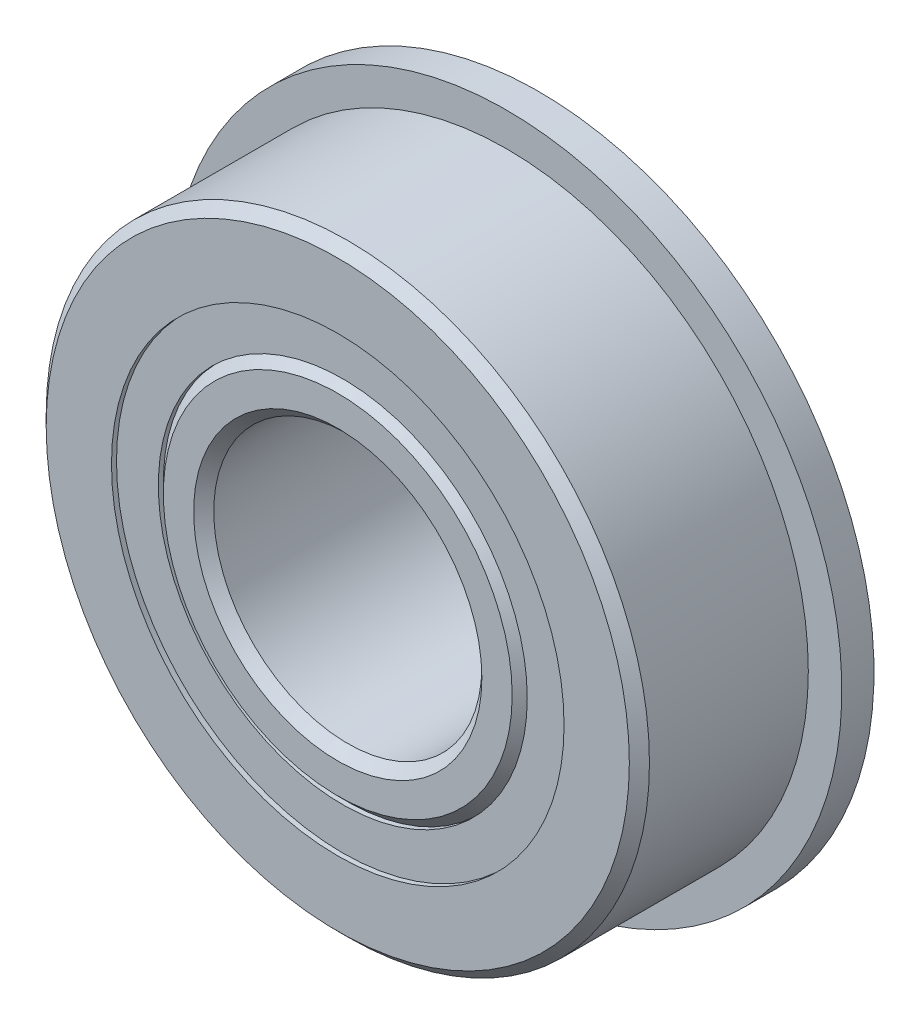
ISO-10303-21;
HEADER;
FILE_DESCRIPTION(('STEP AP214'),'2;1');
FILE_NAME('part.step','',(''),(''),'','','');
FILE_SCHEMA(('AUTOMOTIVE_DESIGN { 1 0 10303 214 1 1 1 1 }'));
ENDSEC;
DATA;
#1=APPLICATION_CONTEXT('core data for automotive mechanical design processes');
#2=APPLICATION_PROTOCOL_DEFINITION('international standard','automotive_design',2000,#1);
#3=PRODUCT_CONTEXT('',#1,'mechanical');
#4=PRODUCT('Part','Part','',(#3));
#5=PRODUCT_RELATED_PRODUCT_CATEGORY('part','',(#4));
#6=PRODUCT_DEFINITION_FORMATION('','',#4);
#7=PRODUCT_DEFINITION_CONTEXT('part definition',#1,'design');
#8=PRODUCT_DEFINITION('design','',#6,#7);
#9=PRODUCT_DEFINITION_SHAPE('','',#8);
#10=(LENGTH_UNIT() NAMED_UNIT(*) SI_UNIT(.MILLI.,.METRE.));
#11=(NAMED_UNIT(*) PLANE_ANGLE_UNIT() SI_UNIT($,.RADIAN.));
#12=(NAMED_UNIT(*) SI_UNIT($,.STERADIAN.) SOLID_ANGLE_UNIT());
#13=UNCERTAINTY_MEASURE_WITH_UNIT(LENGTH_MEASURE(1.E-05),#10,'distance_accuracy_value','');
#14=(GEOMETRIC_REPRESENTATION_CONTEXT(3) GLOBAL_UNCERTAINTY_ASSIGNED_CONTEXT((#13)) GLOBAL_UNIT_ASSIGNED_CONTEXT((#10,
#11,#12)) REPRESENTATION_CONTEXT('',''));
#15=CARTESIAN_POINT('',(0.,0.,0.));
#16=DIRECTION('',(0.,0.,1.));
#17=DIRECTION('',(1.,0.,0.));
#18=AXIS2_PLACEMENT_3D('',#15,#16,#17);
#19=CARTESIAN_POINT('',(0.,10.7188,-4.524375));
#20=DIRECTION('',(0.,0.,1.));
#21=DIRECTION('',(1.,0.,0.));
#22=AXIS2_PLACEMENT_3D('',#19,#20,#21);
#23=PLANE('',#22);
#24=CARTESIAN_POINT('',(0.,0.,-4.524375));
#25=DIRECTION('',(0.,0.,1.));
#26=DIRECTION('',(1.,0.,0.));
#27=AXIS2_PLACEMENT_3D('',#24,#25,#26);
#28=CIRCLE('',#27,10.7188);
#29=CARTESIAN_POINT('',(10.7188,0.,-4.524375));
#30=VERTEX_POINT('',#29);
#31=EDGE_CURVE('E58',#30,#30,#28,.T.);
#32=ORIENTED_EDGE('',*,*,#31,.F.);
#33=EDGE_LOOP('',(#32));
#34=FACE_BOUND('',#33,.T.);
#35=CARTESIAN_POINT('',(0.,0.,-4.524375));
#36=DIRECTION('',(0.,0.,1.));
#37=DIRECTION('',(1.,0.,0.));
#38=AXIS2_PLACEMENT_3D('',#35,#36,#37);
#39=CIRCLE('',#38,8.7376);
#40=CARTESIAN_POINT('',(8.7376,0.,-4.524375));
#41=VERTEX_POINT('',#40);
#42=EDGE_CURVE('E11',#41,#41,#39,.T.);
#43=ORIENTED_EDGE('',*,*,#42,.T.);
#44=EDGE_LOOP('',(#43));
#45=FACE_BOUND('',#44,.T.);
#46=ADVANCED_FACE('F44',(#34,#45),#23,.F.);
#47=CARTESIAN_POINT('',(0.,0.,4.7625));
#48=DIRECTION('',(0.,0.,1.));
#49=DIRECTION('',(1.,0.,0.));
#50=AXIS2_PLACEMENT_3D('',#47,#48,#49);
#51=CYLINDRICAL_SURFACE('',#50,8.7376);
#52=ORIENTED_EDGE('',*,*,#42,.F.);
#53=EDGE_LOOP('',(#52));
#54=FACE_BOUND('',#53,.T.);
#55=CARTESIAN_POINT('',(0.,0.,-1.78053818830151));
#56=DIRECTION('',(0.,0.,1.));
#57=DIRECTION('',(1.,0.,0.));
#58=AXIS2_PLACEMENT_3D('',#55,#56,#57);
#59=CIRCLE('',#58,8.7376);
#60=CARTESIAN_POINT('',(8.7376,0.,-1.78053818830151));
#61=VERTEX_POINT('',#60);
#62=EDGE_CURVE('E50',#61,#61,#59,.T.);
#63=ORIENTED_EDGE('',*,*,#62,.T.);
#64=EDGE_LOOP('',(#63));
#65=FACE_BOUND('',#64,.T.);
#66=ADVANCED_FACE('F67',(#54,#65),#51,.F.);
#67=CARTESIAN_POINT('',(0.,10.7188,-1.78053818830151));
#68=DIRECTION('',(0.,0.,-1.));
#69=DIRECTION('',(-1.,0.,0.));
#70=AXIS2_PLACEMENT_3D('',#67,#68,#69);
#71=PLANE('',#70);
#72=ORIENTED_EDGE('',*,*,#62,.F.);
#73=EDGE_LOOP('',(#72));
#74=FACE_BOUND('',#73,.T.);
#75=CARTESIAN_POINT('',(0.,0.,-1.78053818830151));
#76=DIRECTION('',(0.,0.,1.));
#77=DIRECTION('',(1.,0.,0.));
#78=AXIS2_PLACEMENT_3D('',#75,#76,#77);
#79=CIRCLE('',#78,10.7188);
#80=CARTESIAN_POINT('',(10.7188,0.,-1.78053818830151));
#81=VERTEX_POINT('',#80);
#82=EDGE_CURVE('E54',#81,#81,#79,.T.);
#83=ORIENTED_EDGE('',*,*,#82,.T.);
#84=EDGE_LOOP('',(#83));
#85=FACE_BOUND('',#84,.T.);
#86=ADVANCED_FACE('F71',(#74,#85),#71,.F.);
#87=CARTESIAN_POINT('',(0.,0.,4.7625));
#88=DIRECTION('',(0.,0.,1.));
#89=DIRECTION('',(1.,0.,0.));
#90=AXIS2_PLACEMENT_3D('',#87,#88,#89);
#91=CYLINDRICAL_SURFACE('',#90,10.7188);
#92=ORIENTED_EDGE('',*,*,#82,.F.);
#93=EDGE_LOOP('',(#92));
#94=FACE_BOUND('',#93,.T.);
#95=ORIENTED_EDGE('',*,*,#31,.T.);
#96=EDGE_LOOP('',(#95));
#97=FACE_BOUND('',#96,.T.);
#98=ADVANCED_FACE('F64',(#94,#97),#91,.T.);
#99=CLOSED_SHELL('',(#46,#66,#86,#98));
#100=MANIFOLD_SOLID_BREP('B2',#99);
#101=CARTESIAN_POINT('',(0.,10.7188,4.524375));
#102=DIRECTION('',(0.,0.,-1.));
#103=DIRECTION('',(-1.,0.,0.));
#104=AXIS2_PLACEMENT_3D('',#101,#102,#103);
#105=PLANE('',#104);
#106=CARTESIAN_POINT('',(0.,0.,4.524375));
#107=DIRECTION('',(0.,0.,1.));
#108=DIRECTION('',(1.,0.,0.));
#109=AXIS2_PLACEMENT_3D('',#106,#107,#108);
#110=CIRCLE('',#109,8.7376);
#111=CARTESIAN_POINT('',(8.7376,0.,4.524375));
#112=VERTEX_POINT('',#111);
#113=EDGE_CURVE('E43',#112,#112,#110,.T.);
#114=ORIENTED_EDGE('',*,*,#113,.F.);
#115=EDGE_LOOP('',(#114));
#116=FACE_BOUND('',#115,.T.);
#117=CARTESIAN_POINT('',(0.,0.,4.524375));
#118=DIRECTION('',(0.,0.,1.));
#119=DIRECTION('',(1.,0.,0.));
#120=AXIS2_PLACEMENT_3D('',#117,#118,#119);
#121=CIRCLE('',#120,10.7188);
#122=CARTESIAN_POINT('',(10.7188,0.,4.524375));
#123=VERTEX_POINT('',#122);
#124=EDGE_CURVE('E126',#123,#123,#121,.T.);
#125=ORIENTED_EDGE('',*,*,#124,.T.);
#126=EDGE_LOOP('',(#125));
#127=FACE_BOUND('',#126,.T.);
#128=ADVANCED_FACE('F112',(#116,#127),#105,.F.);
#129=CARTESIAN_POINT('',(0.,0.,4.7625));
#130=DIRECTION('',(0.,0.,1.));
#131=DIRECTION('',(1.,0.,0.));
#132=AXIS2_PLACEMENT_3D('',#129,#130,#131);
#133=CYLINDRICAL_SURFACE('',#132,8.7376);
#134=CARTESIAN_POINT('',(0.,0.,1.7805381883015));
#135=DIRECTION('',(0.,0.,1.));
#136=DIRECTION('',(1.,0.,0.));
#137=AXIS2_PLACEMENT_3D('',#134,#135,#136);
#138=CIRCLE('',#137,8.7376);
#139=CARTESIAN_POINT('',(8.7376,0.,1.7805381883015));
#140=VERTEX_POINT('',#139);
#141=EDGE_CURVE('E118',#140,#140,#138,.T.);
#142=ORIENTED_EDGE('',*,*,#141,.F.);
#143=EDGE_LOOP('',(#142));
#144=FACE_BOUND('',#143,.T.);
#145=ORIENTED_EDGE('',*,*,#113,.T.);
#146=EDGE_LOOP('',(#145));
#147=FACE_BOUND('',#146,.T.);
#148=ADVANCED_FACE('F141',(#144,#147),#133,.F.);
#149=CARTESIAN_POINT('',(0.,10.7188,1.78053818830151));
#150=DIRECTION('',(0.,0.,1.));
#151=DIRECTION('',(1.,0.,0.));
#152=AXIS2_PLACEMENT_3D('',#149,#150,#151);
#153=PLANE('',#152);
#154=CARTESIAN_POINT('',(0.,0.,1.78053818830151));
#155=DIRECTION('',(0.,0.,1.));
#156=DIRECTION('',(1.,0.,0.));
#157=AXIS2_PLACEMENT_3D('',#154,#155,#156);
#158=CIRCLE('',#157,10.7188);
#159=CARTESIAN_POINT('',(10.7188,0.,1.78053818830151));
#160=VERTEX_POINT('',#159);
#161=EDGE_CURVE('E122',#160,#160,#158,.T.);
#162=ORIENTED_EDGE('',*,*,#161,.F.);
#163=EDGE_LOOP('',(#162));
#164=FACE_BOUND('',#163,.T.);
#165=ORIENTED_EDGE('',*,*,#141,.T.);
#166=EDGE_LOOP('',(#165));
#167=FACE_BOUND('',#166,.T.);
#168=ADVANCED_FACE('F136',(#164,#167),#153,.F.);
#169=CARTESIAN_POINT('',(0.,0.,4.7625));
#170=DIRECTION('',(0.,0.,1.));
#171=DIRECTION('',(1.,0.,0.));
#172=AXIS2_PLACEMENT_3D('',#169,#170,#171);
#173=CYLINDRICAL_SURFACE('',#172,10.7188);
#174=ORIENTED_EDGE('',*,*,#124,.F.);
#175=EDGE_LOOP('',(#174));
#176=FACE_BOUND('',#175,.T.);
#177=ORIENTED_EDGE('',*,*,#161,.T.);
#178=EDGE_LOOP('',(#177));
#179=FACE_BOUND('',#178,.T.);
#180=ADVANCED_FACE('F133',(#176,#179),#173,.T.);
#181=CLOSED_SHELL('',(#128,#148,#168,#180));
#182=MANIFOLD_SOLID_BREP('B6',#181);
#183=CARTESIAN_POINT('',(-5.15937499999988,8.93629963530074,0.));
#184=DIRECTION('',(0.,0.,1.));
#185=DIRECTION('',(-0.499999999999989,0.866025403784445,0.));
#186=AXIS2_PLACEMENT_3D('',#183,#184,#185);
#187=SPHERICAL_SURFACE('',#186,2.38125);
#188=CARTESIAN_POINT('',(-5.15937499999988,8.93629963530074,2.38125000000001));
#189=VERTEX_POINT('',#188);
#190=VERTEX_LOOP('',#189);
#191=FACE_BOUND('',#190,.T.);
#192=ADVANCED_FACE('F180',(#191),#187,.T.);
#193=CLOSED_SHELL('',(#192));
#194=MANIFOLD_SOLID_BREP('B38',#193);
#195=CARTESIAN_POINT('',(-8.93629963530061,5.1593750000001,0.));
#196=DIRECTION('',(0.,0.,1.));
#197=DIRECTION('',(-0.866025403784433,0.50000000000001,0.));
#198=AXIS2_PLACEMENT_3D('',#195,#196,#197);
#199=SPHERICAL_SURFACE('',#198,2.38125);
#200=CARTESIAN_POINT('',(-8.93629963530061,5.1593750000001,2.38125000000001));
#201=VERTEX_POINT('',#200);
#202=VERTEX_LOOP('',#201);
#203=FACE_BOUND('',#202,.T.);
#204=ADVANCED_FACE('F201',(#203),#199,.T.);
#205=CLOSED_SHELL('',(#204));
#206=MANIFOLD_SOLID_BREP('B108',#205);
#207=CARTESIAN_POINT('',(-10.31875,1.08083169195563E-13,0.));
#208=DIRECTION('',(0.,0.,1.));
#209=DIRECTION('',(-1.,0.,0.));
#210=AXIS2_PLACEMENT_3D('',#207,#208,#209);
#211=SPHERICAL_SURFACE('',#210,2.38125);
#212=CARTESIAN_POINT('',(-10.31875,1.08083169195563E-13,2.38125000000001));
#213=VERTEX_POINT('',#212);
#214=VERTEX_LOOP('',#213);
#215=FACE_BOUND('',#214,.T.);
#216=ADVANCED_FACE('F222',(#215),#211,.T.);
#217=CLOSED_SHELL('',(#216));
#218=MANIFOLD_SOLID_BREP('B176',#217);
#219=CARTESIAN_POINT('',(-8.93629963530072,-5.15937499999992,0.));
#220=DIRECTION('',(0.,0.,1.));
#221=DIRECTION('',(-0.866025403784443,-0.499999999999992,0.));
#222=AXIS2_PLACEMENT_3D('',#219,#220,#221);
#223=SPHERICAL_SURFACE('',#222,2.38125);
#224=CARTESIAN_POINT('',(-8.93629963530072,-5.15937499999992,2.38125000000001));
#225=VERTEX_POINT('',#224);
#226=VERTEX_LOOP('',#225);
#227=FACE_BOUND('',#226,.T.);
#228=ADVANCED_FACE('F243',(#227),#223,.T.);
#229=CLOSED_SHELL('',(#228));
#230=MANIFOLD_SOLID_BREP('B197',#229);
#231=CARTESIAN_POINT('',(-5.15937500000007,-8.93629963530063,0.));
#232=DIRECTION('',(0.,0.,1.));
#233=DIRECTION('',(-0.500000000000007,-0.866025403784435,0.));
#234=AXIS2_PLACEMENT_3D('',#231,#232,#233);
#235=SPHERICAL_SURFACE('',#234,2.38125);
#236=CARTESIAN_POINT('',(-5.15937500000007,-8.93629963530063,2.38125000000001));
#237=VERTEX_POINT('',#236);
#238=VERTEX_LOOP('',#237);
#239=FACE_BOUND('',#238,.T.);
#240=ADVANCED_FACE('F264',(#239),#235,.T.);
#241=CLOSED_SHELL('',(#240));
#242=MANIFOLD_SOLID_BREP('B218',#241);
#243=CARTESIAN_POINT('',(0.,-10.31875,0.));
#244=DIRECTION('',(0.,0.,1.));
#245=DIRECTION('',(0.,-1.,0.));
#246=AXIS2_PLACEMENT_3D('',#243,#244,#245);
#247=SPHERICAL_SURFACE('',#246,2.38125);
#248=CARTESIAN_POINT('',(0.,-10.31875,2.38125000000001));
#249=VERTEX_POINT('',#248);
#250=VERTEX_LOOP('',#249);
#251=FACE_BOUND('',#250,.T.);
#252=ADVANCED_FACE('F285',(#251),#247,.T.);
#253=CLOSED_SHELL('',(#252));
#254=MANIFOLD_SOLID_BREP('B239',#253);
#255=CARTESIAN_POINT('',(5.15937499999995,-8.9362996353007,0.));
#256=DIRECTION('',(0.,0.,1.));
#257=DIRECTION('',(0.499999999999995,-0.866025403784442,0.));
#258=AXIS2_PLACEMENT_3D('',#255,#256,#257);
#259=SPHERICAL_SURFACE('',#258,2.38125);
#260=CARTESIAN_POINT('',(5.15937499999995,-8.9362996353007,2.38125000000001));
#261=VERTEX_POINT('',#260);
#262=VERTEX_LOOP('',#261);
#263=FACE_BOUND('',#262,.T.);
#264=ADVANCED_FACE('F306',(#263),#259,.T.);
#265=CLOSED_SHELL('',(#264));
#266=MANIFOLD_SOLID_BREP('B260',#265);
#267=CARTESIAN_POINT('',(8.93629963530065,-5.15937500000004,0.));
#268=DIRECTION('',(0.,0.,1.));
#269=DIRECTION('',(0.866025403784436,-0.500000000000004,0.));
#270=AXIS2_PLACEMENT_3D('',#267,#268,#269);
#271=SPHERICAL_SURFACE('',#270,2.38125);
#272=CARTESIAN_POINT('',(8.93629963530065,-5.15937500000004,2.38125000000001));
#273=VERTEX_POINT('',#272);
#274=VERTEX_LOOP('',#273);
#275=FACE_BOUND('',#274,.T.);
#276=ADVANCED_FACE('F327',(#275),#271,.T.);
#277=CLOSED_SHELL('',(#276));
#278=MANIFOLD_SOLID_BREP('B281',#277);
#279=CARTESIAN_POINT('',(10.31875,0.,0.));
#280=DIRECTION('',(0.,0.,1.));
#281=DIRECTION('',(1.,0.,0.));
#282=AXIS2_PLACEMENT_3D('',#279,#280,#281);
#283=SPHERICAL_SURFACE('',#282,2.38125);
#284=CARTESIAN_POINT('',(10.31875,0.,2.38125000000001));
#285=VERTEX_POINT('',#284);
#286=VERTEX_LOOP('',#285);
#287=FACE_BOUND('',#286,.T.);
#288=ADVANCED_FACE('F348',(#287),#283,.T.);
#289=CLOSED_SHELL('',(#288));
#290=MANIFOLD_SOLID_BREP('B302',#289);
#291=CARTESIAN_POINT('',(8.93629963530069,5.15937499999998,0.));
#292=DIRECTION('',(0.,0.,1.));
#293=DIRECTION('',(0.86602540378444,0.499999999999998,0.));
#294=AXIS2_PLACEMENT_3D('',#291,#292,#293);
#295=SPHERICAL_SURFACE('',#294,2.38125);
#296=CARTESIAN_POINT('',(8.93629963530069,5.15937499999998,2.38125000000001));
#297=VERTEX_POINT('',#296);
#298=VERTEX_LOOP('',#297);
#299=FACE_BOUND('',#298,.T.);
#300=ADVANCED_FACE('F369',(#299),#295,.T.);
#301=CLOSED_SHELL('',(#300));
#302=MANIFOLD_SOLID_BREP('B323',#301);
#303=CARTESIAN_POINT('',(5.15937500000001,8.93629963530067,0.));
#304=DIRECTION('',(0.,0.,1.));
#305=DIRECTION('',(0.500000000000001,0.866025403784438,0.));
#306=AXIS2_PLACEMENT_3D('',#303,#304,#305);
#307=SPHERICAL_SURFACE('',#306,2.38125);
#308=CARTESIAN_POINT('',(5.15937500000001,8.93629963530067,2.38125000000001));
#309=VERTEX_POINT('',#308);
#310=VERTEX_LOOP('',#309);
#311=FACE_BOUND('',#310,.T.);
#312=ADVANCED_FACE('F390',(#311),#307,.T.);
#313=CLOSED_SHELL('',(#312));
#314=MANIFOLD_SOLID_BREP('B344',#313);
#315=CARTESIAN_POINT('',(0.,10.31875,0.));
#316=DIRECTION('',(0.,0.,1.));
#317=DIRECTION('',(0.,1.,0.));
#318=AXIS2_PLACEMENT_3D('',#315,#316,#317);
#319=SPHERICAL_SURFACE('',#318,2.38125);
#320=CARTESIAN_POINT('',(0.,10.31875,2.38125000000001));
#321=VERTEX_POINT('',#320);
#322=VERTEX_LOOP('',#321);
#323=FACE_BOUND('',#322,.T.);
#324=ADVANCED_FACE('F413',(#323),#319,.T.);
#325=CLOSED_SHELL('',(#324));
#326=MANIFOLD_SOLID_BREP('B365',#325);
#327=CARTESIAN_POINT('',(0.,0.,4.28625));
#328=DIRECTION('',(0.,0.,-1.));
#329=DIRECTION('',(-1.,0.,0.));
#330=AXIS2_PLACEMENT_3D('',#327,#328,#329);
#331=CONICAL_SURFACE('',#330,8.7376,0.785398163397447);
#332=CARTESIAN_POINT('',(0.,0.,4.7625));
#333=DIRECTION('',(0.,0.,1.));
#334=DIRECTION('',(1.,0.,0.));
#335=AXIS2_PLACEMENT_3D('',#332,#333,#334);
#336=CIRCLE('',#335,8.26135);
#337=CARTESIAN_POINT('',(8.26135,0.,4.7625));
#338=VERTEX_POINT('',#337);
#339=EDGE_CURVE('E412',#338,#338,#336,.T.);
#340=ORIENTED_EDGE('',*,*,#339,.F.);
#341=EDGE_LOOP('',(#340));
#342=FACE_BOUND('',#341,.T.);
#343=CARTESIAN_POINT('',(0.,0.,4.28625));
#344=DIRECTION('',(0.,0.,1.));
#345=DIRECTION('',(1.,0.,0.));
#346=AXIS2_PLACEMENT_3D('',#343,#344,#345);
#347=CIRCLE('',#346,8.7376);
#348=CARTESIAN_POINT('',(8.7376,0.,4.28625));
#349=VERTEX_POINT('',#348);
#350=EDGE_CURVE('E467',#349,#349,#347,.T.);
#351=ORIENTED_EDGE('',*,*,#350,.T.);
#352=EDGE_LOOP('',(#351));
#353=FACE_BOUND('',#352,.T.);
#354=ADVANCED_FACE('F433',(#342,#353),#331,.T.);
#355=CARTESIAN_POINT('',(0.,6.82625,4.7625));
#356=DIRECTION('',(0.,0.,-1.));
#357=DIRECTION('',(-1.,0.,0.));
#358=AXIS2_PLACEMENT_3D('',#355,#356,#357);
#359=PLANE('',#358);
#360=CARTESIAN_POINT('',(0.,0.,4.7625));
#361=DIRECTION('',(0.,0.,1.));
#362=DIRECTION('',(1.,0.,0.));
#363=AXIS2_PLACEMENT_3D('',#360,#361,#362);
#364=CIRCLE('',#363,6.82625);
#365=CARTESIAN_POINT('',(6.82625,0.,4.7625));
#366=VERTEX_POINT('',#365);
#367=EDGE_CURVE('E439',#366,#366,#364,.T.);
#368=ORIENTED_EDGE('',*,*,#367,.F.);
#369=EDGE_LOOP('',(#368));
#370=FACE_BOUND('',#369,.T.);
#371=ORIENTED_EDGE('',*,*,#339,.T.);
#372=EDGE_LOOP('',(#371));
#373=FACE_BOUND('',#372,.T.);
#374=ADVANCED_FACE('F516',(#370,#373),#359,.F.);
#375=CARTESIAN_POINT('',(0.,0.,4.7625));
#376=DIRECTION('',(0.,0.,1.));
#377=DIRECTION('',(1.,0.,0.));
#378=AXIS2_PLACEMENT_3D('',#375,#376,#377);
#379=CONICAL_SURFACE('',#378,6.82625,0.785398163397447);
#380=CARTESIAN_POINT('',(0.,0.,4.28625));
#381=DIRECTION('',(0.,0.,1.));
#382=DIRECTION('',(1.,0.,0.));
#383=AXIS2_PLACEMENT_3D('',#380,#381,#382);
#384=CIRCLE('',#383,6.35);
#385=CARTESIAN_POINT('',(6.35,0.,4.28625));
#386=VERTEX_POINT('',#385);
#387=EDGE_CURVE('E443',#386,#386,#384,.T.);
#388=ORIENTED_EDGE('',*,*,#387,.F.);
#389=EDGE_LOOP('',(#388));
#390=FACE_BOUND('',#389,.T.);
#391=ORIENTED_EDGE('',*,*,#367,.T.);
#392=EDGE_LOOP('',(#391));
#393=FACE_BOUND('',#392,.T.);
#394=ADVANCED_FACE('F511',(#390,#393),#379,.F.);
#395=CARTESIAN_POINT('',(0.,0.,4.7625));
#396=DIRECTION('',(0.,0.,1.));
#397=DIRECTION('',(1.,0.,0.));
#398=AXIS2_PLACEMENT_3D('',#395,#396,#397);
#399=CYLINDRICAL_SURFACE('',#398,6.35);
#400=CARTESIAN_POINT('',(0.,0.,-5.88645));
#401=DIRECTION('',(0.,0.,1.));
#402=DIRECTION('',(1.,0.,0.));
#403=AXIS2_PLACEMENT_3D('',#400,#401,#402);
#404=CIRCLE('',#403,6.35);
#405=CARTESIAN_POINT('',(6.35,0.,-5.88645));
#406=VERTEX_POINT('',#405);
#407=EDGE_CURVE('E447',#406,#406,#404,.T.);
#408=ORIENTED_EDGE('',*,*,#407,.F.);
#409=EDGE_LOOP('',(#408));
#410=FACE_BOUND('',#409,.T.);
#411=ORIENTED_EDGE('',*,*,#387,.T.);
#412=EDGE_LOOP('',(#411));
#413=FACE_BOUND('',#412,.T.);
#414=ADVANCED_FACE('F505',(#410,#413),#399,.F.);
#415=CARTESIAN_POINT('',(0.,0.,-5.88645));
#416=DIRECTION('',(0.,0.,-1.));
#417=DIRECTION('',(-1.,0.,0.));
#418=AXIS2_PLACEMENT_3D('',#415,#416,#417);
#419=CONICAL_SURFACE('',#418,6.35,0.785398163397448);
#420=CARTESIAN_POINT('',(0.,0.,-6.3627));
#421=DIRECTION('',(0.,0.,1.));
#422=DIRECTION('',(1.,0.,0.));
#423=AXIS2_PLACEMENT_3D('',#420,#421,#422);
#424=CIRCLE('',#423,6.82625);
#425=CARTESIAN_POINT('',(6.82625,0.,-6.3627));
#426=VERTEX_POINT('',#425);
#427=EDGE_CURVE('E452',#426,#426,#424,.T.);
#428=ORIENTED_EDGE('',*,*,#427,.F.);
#429=EDGE_LOOP('',(#428));
#430=FACE_BOUND('',#429,.T.);
#431=ORIENTED_EDGE('',*,*,#407,.T.);
#432=EDGE_LOOP('',(#431));
#433=FACE_BOUND('',#432,.T.);
#434=ADVANCED_FACE('F499',(#430,#433),#419,.F.);
#435=CARTESIAN_POINT('',(0.,8.26135,-6.3627));
#436=DIRECTION('',(0.,0.,1.));
#437=DIRECTION('',(1.,0.,0.));
#438=AXIS2_PLACEMENT_3D('',#435,#436,#437);
#439=PLANE('',#438);
#440=CARTESIAN_POINT('',(0.,0.,-6.3627));
#441=DIRECTION('',(0.,0.,1.));
#442=DIRECTION('',(1.,0.,0.));
#443=AXIS2_PLACEMENT_3D('',#440,#441,#442);
#444=CIRCLE('',#443,8.26135);
#445=CARTESIAN_POINT('',(8.26135,0.,-6.3627));
#446=VERTEX_POINT('',#445);
#447=EDGE_CURVE('E455',#446,#446,#444,.T.);
#448=ORIENTED_EDGE('',*,*,#447,.F.);
#449=EDGE_LOOP('',(#448));
#450=FACE_BOUND('',#449,.T.);
#451=ORIENTED_EDGE('',*,*,#427,.T.);
#452=EDGE_LOOP('',(#451));
#453=FACE_BOUND('',#452,.T.);
#454=ADVANCED_FACE('F493',(#450,#453),#439,.F.);
#455=CARTESIAN_POINT('',(0.,0.,-6.3627));
#456=DIRECTION('',(0.,0.,1.));
#457=DIRECTION('',(1.,0.,0.));
#458=AXIS2_PLACEMENT_3D('',#455,#456,#457);
#459=CONICAL_SURFACE('',#458,8.26135,0.785398163397448);
#460=CARTESIAN_POINT('',(0.,0.,-5.88645));
#461=DIRECTION('',(0.,0.,1.));
#462=DIRECTION('',(1.,0.,0.));
#463=AXIS2_PLACEMENT_3D('',#460,#461,#462);
#464=CIRCLE('',#463,8.7376);
#465=CARTESIAN_POINT('',(8.7376,0.,-5.88645));
#466=VERTEX_POINT('',#465);
#467=EDGE_CURVE('E458',#466,#466,#464,.T.);
#468=ORIENTED_EDGE('',*,*,#467,.F.);
#469=EDGE_LOOP('',(#468));
#470=FACE_BOUND('',#469,.T.);
#471=ORIENTED_EDGE('',*,*,#447,.T.);
#472=EDGE_LOOP('',(#471));
#473=FACE_BOUND('',#472,.T.);
#474=ADVANCED_FACE('F487',(#470,#473),#459,.T.);
#475=CARTESIAN_POINT('',(0.,0.,4.7625));
#476=DIRECTION('',(0.,0.,1.));
#477=DIRECTION('',(1.,0.,0.));
#478=AXIS2_PLACEMENT_3D('',#475,#476,#477);
#479=CYLINDRICAL_SURFACE('',#478,8.7376);
#480=CARTESIAN_POINT('',(0.,0.,-1.78053818830151));
#481=DIRECTION('',(0.,0.,1.));
#482=DIRECTION('',(1.,0.,0.));
#483=AXIS2_PLACEMENT_3D('',#480,#481,#482);
#484=CIRCLE('',#483,8.7376);
#485=CARTESIAN_POINT('',(8.7376,0.,-1.78053818830151));
#486=VERTEX_POINT('',#485);
#487=EDGE_CURVE('E461',#486,#486,#484,.T.);
#488=ORIENTED_EDGE('',*,*,#487,.F.);
#489=EDGE_LOOP('',(#488));
#490=FACE_BOUND('',#489,.T.);
#491=ORIENTED_EDGE('',*,*,#467,.T.);
#492=EDGE_LOOP('',(#491));
#493=FACE_BOUND('',#492,.T.);
#494=ADVANCED_FACE('F481',(#490,#493),#479,.T.);
#495=CARTESIAN_POINT('',(0.,0.,0.));
#496=DIRECTION('',(0.,0.,1.));
#497=DIRECTION('',(1.,0.,0.));
#498=AXIS2_PLACEMENT_3D('',#495,#496,#497);
#499=TOROIDAL_SURFACE('',#498,10.31875,2.38125);
#500=CARTESIAN_POINT('',(0.,0.,1.78053818830151));
#501=DIRECTION('',(0.,0.,1.));
#502=DIRECTION('',(1.,0.,0.));
#503=AXIS2_PLACEMENT_3D('',#500,#501,#502);
#504=CIRCLE('',#503,8.7376);
#505=CARTESIAN_POINT('',(8.7376,0.,1.78053818830151));
#506=VERTEX_POINT('',#505);
#507=EDGE_CURVE('E464',#506,#506,#504,.T.);
#508=ORIENTED_EDGE('',*,*,#507,.F.);
#509=EDGE_LOOP('',(#508));
#510=FACE_BOUND('',#509,.T.);
#511=ORIENTED_EDGE('',*,*,#487,.T.);
#512=EDGE_LOOP('',(#511));
#513=FACE_BOUND('',#512,.T.);
#514=ADVANCED_FACE('F475',(#510,#513),#499,.F.);
#515=CARTESIAN_POINT('',(0.,0.,4.7625));
#516=DIRECTION('',(0.,0.,1.));
#517=DIRECTION('',(1.,0.,0.));
#518=AXIS2_PLACEMENT_3D('',#515,#516,#517);
#519=CYLINDRICAL_SURFACE('',#518,8.7376);
#520=ORIENTED_EDGE('',*,*,#350,.F.);
#521=EDGE_LOOP('',(#520));
#522=FACE_BOUND('',#521,.T.);
#523=ORIENTED_EDGE('',*,*,#507,.T.);
#524=EDGE_LOOP('',(#523));
#525=FACE_BOUND('',#524,.T.);
#526=ADVANCED_FACE('F472',(#522,#525),#519,.T.);
#527=CLOSED_SHELL('',(#354,#374,#394,#414,#434,#454,#474,#494,#514,#526));
#528=MANIFOLD_SOLID_BREP('B386',#527);
#529=CARTESIAN_POINT('',(0.,0.,4.28625));
#530=DIRECTION('',(0.,0.,-1.));
#531=DIRECTION('',(-1.,0.,0.));
#532=AXIS2_PLACEMENT_3D('',#529,#530,#531);
#533=CONICAL_SURFACE('',#532,14.2875,0.785398163397442);
#534=CARTESIAN_POINT('',(0.,0.,4.7625));
#535=DIRECTION('',(0.,0.,1.));
#536=DIRECTION('',(1.,0.,0.));
#537=AXIS2_PLACEMENT_3D('',#534,#535,#536);
#538=CIRCLE('',#537,13.81125);
#539=CARTESIAN_POINT('',(13.81125,0.,4.7625));
#540=VERTEX_POINT('',#539);
#541=EDGE_CURVE('E607',#540,#540,#538,.T.);
#542=ORIENTED_EDGE('',*,*,#541,.F.);
#543=EDGE_LOOP('',(#542));
#544=FACE_BOUND('',#543,.T.);
#545=CARTESIAN_POINT('',(0.,0.,4.28625));
#546=DIRECTION('',(0.,0.,1.));
#547=DIRECTION('',(1.,0.,0.));
#548=AXIS2_PLACEMENT_3D('',#545,#546,#547);
#549=CIRCLE('',#548,14.2875);
#550=CARTESIAN_POINT('',(14.2875,0.,4.28625));
#551=VERTEX_POINT('',#550);
#552=EDGE_CURVE('E432',#551,#551,#549,.T.);
#553=ORIENTED_EDGE('',*,*,#552,.T.);
#554=EDGE_LOOP('',(#553));
#555=FACE_BOUND('',#554,.T.);
#556=ADVANCED_FACE('F585',(#544,#555),#533,.T.);
#557=CARTESIAN_POINT('',(0.,0.,4.7625));
#558=DIRECTION('',(0.,0.,1.));
#559=DIRECTION('',(1.,0.,0.));
#560=AXIS2_PLACEMENT_3D('',#557,#558,#559);
#561=CYLINDRICAL_SURFACE('',#560,14.2875);
#562=CARTESIAN_POINT('',(0.,0.,-3.2385));
#563=DIRECTION('',(0.,0.,1.));
#564=DIRECTION('',(1.,0.,0.));
#565=AXIS2_PLACEMENT_3D('',#562,#563,#564);
#566=CIRCLE('',#565,14.2875);
#567=CARTESIAN_POINT('',(14.2875,0.,-3.2385));
#568=VERTEX_POINT('',#567);
#569=EDGE_CURVE('E610',#568,#568,#566,.T.);
#570=ORIENTED_EDGE('',*,*,#569,.T.);
#571=EDGE_LOOP('',(#570));
#572=FACE_BOUND('',#571,.T.);
#573=ORIENTED_EDGE('',*,*,#552,.F.);
#574=EDGE_LOOP('',(#573));
#575=FACE_BOUND('',#574,.T.);
#576=ADVANCED_FACE('F630',(#572,#575),#561,.T.);
#577=CARTESIAN_POINT('',(0.,13.81125,-4.7625));
#578=DIRECTION('',(0.,0.,1.));
#579=DIRECTION('',(1.,0.,0.));
#580=AXIS2_PLACEMENT_3D('',#577,#578,#579);
#581=PLANE('',#580);
#582=CARTESIAN_POINT('',(0.,0.,-4.7625));
#583=DIRECTION('',(0.,0.,1.));
#584=DIRECTION('',(1.,0.,0.));
#585=AXIS2_PLACEMENT_3D('',#582,#583,#584);
#586=CIRCLE('',#585,10.7188);
#587=CARTESIAN_POINT('',(10.7188,0.,-4.7625));
#588=VERTEX_POINT('',#587);
#589=EDGE_CURVE('E591',#588,#588,#586,.T.);
#590=ORIENTED_EDGE('',*,*,#589,.T.);
#591=EDGE_LOOP('',(#590));
#592=FACE_BOUND('',#591,.T.);
#593=CARTESIAN_POINT('',(0.,0.,-4.7625));
#594=DIRECTION('',(0.,0.,-1.));
#595=DIRECTION('',(-1.,0.,0.));
#596=AXIS2_PLACEMENT_3D('',#593,#594,#595);
#597=CIRCLE('',#596,15.875);
#598=CARTESIAN_POINT('',(-15.875,0.,-4.7625));
#599=VERTEX_POINT('',#598);
#600=EDGE_CURVE('E613',#599,#599,#597,.T.);
#601=ORIENTED_EDGE('',*,*,#600,.T.);
#602=EDGE_LOOP('',(#601));
#603=FACE_BOUND('',#602,.T.);
#604=ADVANCED_FACE('F633',(#592,#603),#581,.F.);
#605=CARTESIAN_POINT('',(0.,0.,4.7625));
#606=DIRECTION('',(0.,0.,1.));
#607=DIRECTION('',(1.,0.,0.));
#608=AXIS2_PLACEMENT_3D('',#605,#606,#607);
#609=CYLINDRICAL_SURFACE('',#608,10.7188);
#610=CARTESIAN_POINT('',(0.,0.,-2.34740528243421));
#611=DIRECTION('',(0.,0.,1.));
#612=DIRECTION('',(1.,0.,0.));
#613=AXIS2_PLACEMENT_3D('',#610,#611,#612);
#614=CIRCLE('',#613,10.7188);
#615=CARTESIAN_POINT('',(10.7188,0.,-2.34740528243421));
#616=VERTEX_POINT('',#615);
#617=EDGE_CURVE('E595',#616,#616,#614,.T.);
#618=ORIENTED_EDGE('',*,*,#617,.T.);
#619=EDGE_LOOP('',(#618));
#620=FACE_BOUND('',#619,.T.);
#621=ORIENTED_EDGE('',*,*,#589,.F.);
#622=EDGE_LOOP('',(#621));
#623=FACE_BOUND('',#622,.T.);
#624=ADVANCED_FACE('F638',(#620,#623),#609,.F.);
#625=CARTESIAN_POINT('',(0.,0.,0.));
#626=DIRECTION('',(0.,0.,1.));
#627=DIRECTION('',(1.,0.,0.));
#628=AXIS2_PLACEMENT_3D('',#625,#626,#627);
#629=TOROIDAL_SURFACE('',#628,10.31875,2.38125);
#630=ORIENTED_EDGE('',*,*,#617,.F.);
#631=EDGE_LOOP('',(#630));
#632=FACE_BOUND('',#631,.T.);
#633=CARTESIAN_POINT('',(0.,0.,2.34740528243421));
#634=DIRECTION('',(0.,0.,1.));
#635=DIRECTION('',(1.,0.,0.));
#636=AXIS2_PLACEMENT_3D('',#633,#634,#635);
#637=CIRCLE('',#636,10.7188);
#638=CARTESIAN_POINT('',(10.7188,0.,2.34740528243421));
#639=VERTEX_POINT('',#638);
#640=EDGE_CURVE('E599',#639,#639,#637,.T.);
#641=ORIENTED_EDGE('',*,*,#640,.T.);
#642=EDGE_LOOP('',(#641));
#643=FACE_BOUND('',#642,.T.);
#644=ADVANCED_FACE('F644',(#632,#643),#629,.F.);
#645=CARTESIAN_POINT('',(0.,0.,4.7625));
#646=DIRECTION('',(0.,0.,1.));
#647=DIRECTION('',(1.,0.,0.));
#648=AXIS2_PLACEMENT_3D('',#645,#646,#647);
#649=CYLINDRICAL_SURFACE('',#648,10.7188);
#650=ORIENTED_EDGE('',*,*,#640,.F.);
#651=EDGE_LOOP('',(#650));
#652=FACE_BOUND('',#651,.T.);
#653=CARTESIAN_POINT('',(0.,0.,4.7625));
#654=DIRECTION('',(0.,0.,1.));
#655=DIRECTION('',(1.,0.,0.));
#656=AXIS2_PLACEMENT_3D('',#653,#654,#655);
#657=CIRCLE('',#656,10.7188);
#658=CARTESIAN_POINT('',(10.7188,0.,4.7625));
#659=VERTEX_POINT('',#658);
#660=EDGE_CURVE('E604',#659,#659,#657,.T.);
#661=ORIENTED_EDGE('',*,*,#660,.T.);
#662=EDGE_LOOP('',(#661));
#663=FACE_BOUND('',#662,.T.);
#664=ADVANCED_FACE('F648',(#652,#663),#649,.F.);
#665=CARTESIAN_POINT('',(0.,13.81125,4.7625));
#666=DIRECTION('',(0.,0.,-1.));
#667=DIRECTION('',(-1.,0.,0.));
#668=AXIS2_PLACEMENT_3D('',#665,#666,#667);
#669=PLANE('',#668);
#670=ORIENTED_EDGE('',*,*,#660,.F.);
#671=EDGE_LOOP('',(#670));
#672=FACE_BOUND('',#671,.T.);
#673=ORIENTED_EDGE('',*,*,#541,.T.);
#674=EDGE_LOOP('',(#673));
#675=FACE_BOUND('',#674,.T.);
#676=ADVANCED_FACE('F626',(#672,#675),#669,.F.);
#677=CARTESIAN_POINT('',(0.,10.7188,-3.2385));
#678=DIRECTION('',(0.,0.,1.));
#679=DIRECTION('',(1.,0.,0.));
#680=AXIS2_PLACEMENT_3D('',#677,#678,#679);
#681=PLANE('',#680);
#682=CARTESIAN_POINT('',(0.,0.,-3.2385));
#683=DIRECTION('',(0.,0.,-1.));
#684=DIRECTION('',(-1.,0.,0.));
#685=AXIS2_PLACEMENT_3D('',#682,#683,#684);
#686=CIRCLE('',#685,15.875);
#687=CARTESIAN_POINT('',(-15.875,0.,-3.2385));
#688=VERTEX_POINT('',#687);
#689=EDGE_CURVE('E616',#688,#688,#686,.T.);
#690=ORIENTED_EDGE('',*,*,#689,.F.);
#691=EDGE_LOOP('',(#690));
#692=FACE_BOUND('',#691,.T.);
#693=ORIENTED_EDGE('',*,*,#569,.F.);
#694=EDGE_LOOP('',(#693));
#695=FACE_BOUND('',#694,.T.);
#696=ADVANCED_FACE('F623',(#692,#695),#681,.T.);
#697=CARTESIAN_POINT('',(0.,0.,-4.7625));
#698=DIRECTION('',(0.,0.,-1.));
#699=DIRECTION('',(-1.,0.,0.));
#700=AXIS2_PLACEMENT_3D('',#697,#698,#699);
#701=CYLINDRICAL_SURFACE('',#700,15.875);
#702=ORIENTED_EDGE('',*,*,#689,.T.);
#703=EDGE_LOOP('',(#702));
#704=FACE_BOUND('',#703,.T.);
#705=ORIENTED_EDGE('',*,*,#600,.F.);
#706=EDGE_LOOP('',(#705));
#707=FACE_BOUND('',#706,.T.);
#708=ADVANCED_FACE('F620',(#704,#707),#701,.T.);
#709=CLOSED_SHELL('',(#556,#576,#604,#624,#644,#664,#676,#696,#708));
#710=MANIFOLD_SOLID_BREP('B407',#709);
#711=ADVANCED_BREP_SHAPE_REPRESENTATION('',(#18,#100,#182,#194,#206,#218,#230,#242,#254,#266,
#278,#290,#302,#314,#326,#528,#710),#14);
#712=SHAPE_DEFINITION_REPRESENTATION(#9,#711);
ENDSEC;
END-ISO-10303-21;
